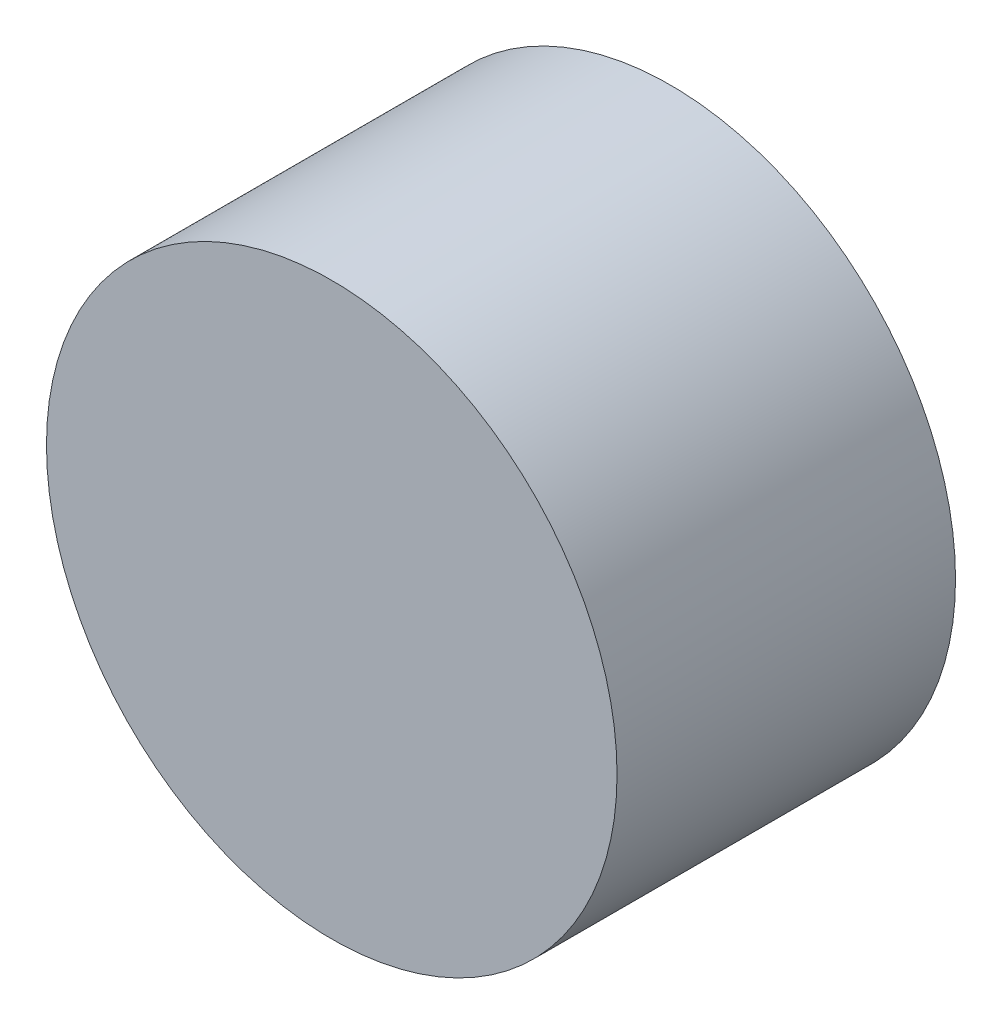
ISO-10303-21;
HEADER;
FILE_DESCRIPTION(('STEP AP214'),'2;1');
FILE_NAME('part.step','',(''),(''),'','','');
FILE_SCHEMA(('AUTOMOTIVE_DESIGN { 1 0 10303 214 1 1 1 1 }'));
ENDSEC;
DATA;
#1=APPLICATION_CONTEXT('core data for automotive mechanical design processes');
#2=APPLICATION_PROTOCOL_DEFINITION('international standard','automotive_design',2000,#1);
#3=PRODUCT_CONTEXT('',#1,'mechanical');
#4=PRODUCT('Part','Part','',(#3));
#5=PRODUCT_RELATED_PRODUCT_CATEGORY('part','',(#4));
#6=PRODUCT_DEFINITION_FORMATION('','',#4);
#7=PRODUCT_DEFINITION_CONTEXT('part definition',#1,'design');
#8=PRODUCT_DEFINITION('design','',#6,#7);
#9=PRODUCT_DEFINITION_SHAPE('','',#8);
#10=(LENGTH_UNIT() NAMED_UNIT(*) SI_UNIT(.MILLI.,.METRE.));
#11=(NAMED_UNIT(*) PLANE_ANGLE_UNIT() SI_UNIT($,.RADIAN.));
#12=(NAMED_UNIT(*) SI_UNIT($,.STERADIAN.) SOLID_ANGLE_UNIT());
#13=UNCERTAINTY_MEASURE_WITH_UNIT(LENGTH_MEASURE(1.E-05),#10,'distance_accuracy_value','');
#14=(GEOMETRIC_REPRESENTATION_CONTEXT(3) GLOBAL_UNCERTAINTY_ASSIGNED_CONTEXT((#13)) GLOBAL_UNIT_ASSIGNED_CONTEXT((#10,
#11,#12)) REPRESENTATION_CONTEXT('',''));
#15=CARTESIAN_POINT('',(0.,0.,0.));
#16=DIRECTION('',(0.,0.,1.));
#17=DIRECTION('',(1.,0.,0.));
#18=AXIS2_PLACEMENT_3D('',#15,#16,#17);
#19=CARTESIAN_POINT('',(0.,0.,3.5));
#20=DIRECTION('',(0.,0.,-1.));
#21=DIRECTION('',(-1.,0.,0.));
#22=AXIS2_PLACEMENT_3D('',#19,#20,#21);
#23=CYLINDRICAL_SURFACE('',#22,2.95);
#24=CARTESIAN_POINT('',(0.,0.,3.5));
#25=DIRECTION('',(0.,0.,1.));
#26=DIRECTION('',(1.,0.,0.));
#27=AXIS2_PLACEMENT_3D('',#24,#25,#26);
#28=CIRCLE('',#27,2.95);
#29=CARTESIAN_POINT('',(2.95,0.,3.5));
#30=VERTEX_POINT('',#29);
#31=EDGE_CURVE('E10',#30,#30,#28,.T.);
#32=ORIENTED_EDGE('',*,*,#31,.F.);
#33=EDGE_LOOP('',(#32));
#34=FACE_BOUND('',#33,.T.);
#35=CARTESIAN_POINT('',(0.,0.,0.));
#36=DIRECTION('',(0.,0.,1.));
#37=DIRECTION('',(1.,0.,0.));
#38=AXIS2_PLACEMENT_3D('',#35,#36,#37);
#39=CIRCLE('',#38,2.95);
#40=CARTESIAN_POINT('',(2.95,0.,0.));
#41=VERTEX_POINT('',#40);
#42=EDGE_CURVE('E40',#41,#41,#39,.T.);
#43=ORIENTED_EDGE('',*,*,#42,.T.);
#44=EDGE_LOOP('',(#43));
#45=FACE_BOUND('',#44,.T.);
#46=ADVANCED_FACE('F37',(#34,#45),#23,.T.);
#47=CARTESIAN_POINT('',(0.,0.,3.5));
#48=DIRECTION('',(0.,0.,1.));
#49=DIRECTION('',(1.,0.,0.));
#50=AXIS2_PLACEMENT_3D('',#47,#48,#49);
#51=PLANE('',#50);
#52=ORIENTED_EDGE('',*,*,#31,.T.);
#53=EDGE_LOOP('',(#52));
#54=FACE_BOUND('',#53,.T.);
#55=ADVANCED_FACE('F52',(#54),#51,.T.);
#56=CARTESIAN_POINT('',(0.,0.,0.));
#57=DIRECTION('',(0.,0.,1.));
#58=DIRECTION('',(1.,0.,0.));
#59=AXIS2_PLACEMENT_3D('',#56,#57,#58);
#60=PLANE('',#59);
#61=ORIENTED_EDGE('',*,*,#42,.F.);
#62=EDGE_LOOP('',(#61));
#63=FACE_BOUND('',#62,.T.);
#64=ADVANCED_FACE('F50',(#63),#60,.F.);
#65=CLOSED_SHELL('',(#46,#55,#64));
#66=MANIFOLD_SOLID_BREP('B2',#65);
#67=ADVANCED_BREP_SHAPE_REPRESENTATION('',(#18,#66),#14);
#68=SHAPE_DEFINITION_REPRESENTATION(#9,#67);
ENDSEC;
END-ISO-10303-21;
